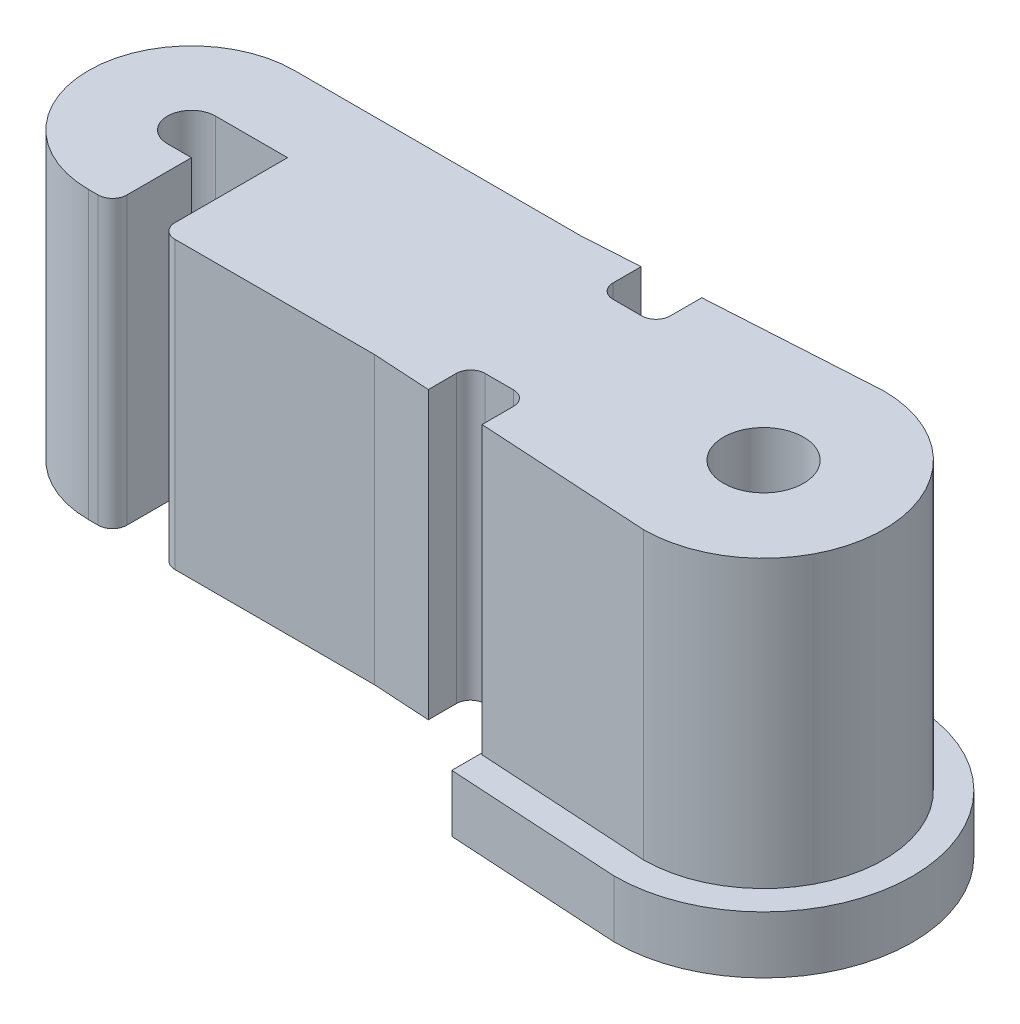
ISO-10303-21;
HEADER;
FILE_DESCRIPTION(('STEP AP214'),'2;1');
FILE_NAME('part.step','',(''),(''),'','','');
FILE_SCHEMA(('AUTOMOTIVE_DESIGN { 1 0 10303 214 1 1 1 1 }'));
ENDSEC;
DATA;
#1=APPLICATION_CONTEXT('core data for automotive mechanical design processes');
#2=APPLICATION_PROTOCOL_DEFINITION('international standard','automotive_design',2000,#1);
#3=PRODUCT_CONTEXT('',#1,'mechanical');
#4=PRODUCT('Part','Part','',(#3));
#5=PRODUCT_RELATED_PRODUCT_CATEGORY('part','',(#4));
#6=PRODUCT_DEFINITION_FORMATION('','',#4);
#7=PRODUCT_DEFINITION_CONTEXT('part definition',#1,'design');
#8=PRODUCT_DEFINITION('design','',#6,#7);
#9=PRODUCT_DEFINITION_SHAPE('','',#8);
#10=(LENGTH_UNIT() NAMED_UNIT(*) SI_UNIT(.MILLI.,.METRE.));
#11=(NAMED_UNIT(*) PLANE_ANGLE_UNIT() SI_UNIT($,.RADIAN.));
#12=(NAMED_UNIT(*) SI_UNIT($,.STERADIAN.) SOLID_ANGLE_UNIT());
#13=UNCERTAINTY_MEASURE_WITH_UNIT(LENGTH_MEASURE(1.E-05),#10,'distance_accuracy_value','');
#14=(GEOMETRIC_REPRESENTATION_CONTEXT(3) GLOBAL_UNCERTAINTY_ASSIGNED_CONTEXT((#13)) GLOBAL_UNIT_ASSIGNED_CONTEXT((#10,
#11,#12)) REPRESENTATION_CONTEXT('',''));
#15=CARTESIAN_POINT('',(0.,0.,0.));
#16=DIRECTION('',(0.,0.,1.));
#17=DIRECTION('',(1.,0.,0.));
#18=AXIS2_PLACEMENT_3D('',#15,#16,#17);
#19=CARTESIAN_POINT('',(0.,0.,0.));
#20=DIRECTION('',(0.,-1.,0.));
#21=DIRECTION('',(0.,0.,-1.));
#22=AXIS2_PLACEMENT_3D('',#19,#20,#21);
#23=PLANE('',#22);
#24=CARTESIAN_POINT('',(-1.625,0.,-0.685));
#25=DIRECTION('',(0.,-1.,0.));
#26=DIRECTION('',(0.,0.,-1.));
#27=AXIS2_PLACEMENT_3D('',#24,#25,#26);
#28=CIRCLE('',#27,0.125);
#29=CARTESIAN_POINT('',(-1.625,0.,-0.56));
#30=VERTEX_POINT('',#29);
#31=CARTESIAN_POINT('',(-1.51497307268199,0.,-0.625678205818127));
#32=VERTEX_POINT('',#31);
#33=EDGE_CURVE('E477',#30,#32,#28,.F.);
#34=ORIENTED_EDGE('',*,*,#33,.T.);
#35=DIRECTION('',(0.,0.,1.));
#36=VECTOR('',#35,1.);
#37=CARTESIAN_POINT('',(-1.51497307268199,0.,1.20955121136645));
#38=LINE('',#37,#36);
#39=CARTESIAN_POINT('',(-1.51497307268199,0.,0.625678205818127));
#40=VERTEX_POINT('',#39);
#41=EDGE_CURVE('E11',#32,#40,#38,.T.);
#42=ORIENTED_EDGE('',*,*,#41,.T.);
#43=CARTESIAN_POINT('',(-1.625,0.,0.685));
#44=DIRECTION('',(0.,-1.,0.));
#45=DIRECTION('',(0.,0.,-1.));
#46=AXIS2_PLACEMENT_3D('',#43,#44,#45);
#47=CIRCLE('',#46,0.125);
#48=CARTESIAN_POINT('',(-1.625,0.,0.56));
#49=VERTEX_POINT('',#48);
#50=EDGE_CURVE('E471',#40,#49,#47,.F.);
#51=ORIENTED_EDGE('',*,*,#50,.T.);
#52=DIRECTION('',(-1.,0.,0.));
#53=VECTOR('',#52,1.);
#54=CARTESIAN_POINT('',(-1.5,0.,0.56));
#55=LINE('',#54,#53);
#56=CARTESIAN_POINT('',(-1.875,0.,0.56));
#57=VERTEX_POINT('',#56);
#58=EDGE_CURVE('E390',#49,#57,#55,.T.);
#59=ORIENTED_EDGE('',*,*,#58,.T.);
#60=CARTESIAN_POINT('',(-1.875,0.,0.685));
#61=DIRECTION('',(0.,-1.,0.));
#62=DIRECTION('',(0.,0.,-1.));
#63=AXIS2_PLACEMENT_3D('',#60,#61,#62);
#64=CIRCLE('',#63,0.125);
#65=CARTESIAN_POINT('',(-2.,0.,0.685));
#66=VERTEX_POINT('',#65);
#67=EDGE_CURVE('E60',#57,#66,#64,.F.);
#68=ORIENTED_EDGE('',*,*,#67,.T.);
#69=DIRECTION('',(0.,0.,-1.));
#70=VECTOR('',#69,1.);
#71=CARTESIAN_POINT('',(-2.,0.,0.93));
#72=LINE('',#71,#70);
#73=CARTESIAN_POINT('',(-2.,0.,0.93));
#74=VERTEX_POINT('',#73);
#75=EDGE_CURVE('E392',#74,#66,#72,.T.);
#76=ORIENTED_EDGE('',*,*,#75,.F.);
#77=DIRECTION('',(0.998204845465779,0.,0.0598922907279451));
#78=VECTOR('',#77,1.);
#79=CARTESIAN_POINT('',(-2.50000000000002,0.,0.9));
#80=LINE('',#79,#78);
#81=CARTESIAN_POINT('',(-2.50000000000002,0.,0.9));
#82=VERTEX_POINT('',#81);
#83=EDGE_CURVE('E394',#82,#74,#80,.T.);
#84=ORIENTED_EDGE('',*,*,#83,.F.);
#85=DIRECTION('',(-1.,0.,0.));
#86=VECTOR('',#85,1.);
#87=CARTESIAN_POINT('',(-2.50000000000002,0.,0.9));
#88=LINE('',#87,#86);
#89=CARTESIAN_POINT('',(-4.245,0.,0.9));
#90=VERTEX_POINT('',#89);
#91=EDGE_CURVE('E397',#82,#90,#88,.T.);
#92=ORIENTED_EDGE('',*,*,#91,.T.);
#93=CARTESIAN_POINT('',(-4.245,0.,0.775));
#94=DIRECTION('',(0.,-1.,0.));
#95=DIRECTION('',(0.,0.,-1.));
#96=AXIS2_PLACEMENT_3D('',#93,#94,#95);
#97=CIRCLE('',#96,0.125);
#98=CARTESIAN_POINT('',(-4.37,0.,0.775));
#99=VERTEX_POINT('',#98);
#100=EDGE_CURVE('E441',#90,#99,#97,.T.);
#101=ORIENTED_EDGE('',*,*,#100,.T.);
#102=DIRECTION('',(0.,0.,-1.));
#103=VECTOR('',#102,1.);
#104=CARTESIAN_POINT('',(-4.37,0.,0.9));
#105=LINE('',#104,#103);
#106=CARTESIAN_POINT('',(-4.37,0.,-0.21));
#107=VERTEX_POINT('',#106);
#108=EDGE_CURVE('E300',#99,#107,#105,.T.);
#109=ORIENTED_EDGE('',*,*,#108,.T.);
#110=DIRECTION('',(-1.,0.,0.));
#111=VECTOR('',#110,1.);
#112=CARTESIAN_POINT('',(-4.37,0.,-0.21));
#113=LINE('',#112,#111);
#114=CARTESIAN_POINT('',(-5.,0.,-0.21));
#115=VERTEX_POINT('',#114);
#116=EDGE_CURVE('E302',#107,#115,#113,.T.);
#117=ORIENTED_EDGE('',*,*,#116,.T.);
#118=CARTESIAN_POINT('',(-5.,0.,0.));
#119=DIRECTION('',(0.,1.,0.));
#120=DIRECTION('',(0.,0.,1.));
#121=AXIS2_PLACEMENT_3D('',#118,#119,#120);
#122=CIRCLE('',#121,0.21);
#123=CARTESIAN_POINT('',(-5.,0.,0.21));
#124=VERTEX_POINT('',#123);
#125=EDGE_CURVE('E305',#115,#124,#122,.T.);
#126=ORIENTED_EDGE('',*,*,#125,.T.);
#127=DIRECTION('',(1.,0.,0.));
#128=VECTOR('',#127,1.);
#129=CARTESIAN_POINT('',(-4.79,0.,0.21));
#130=LINE('',#129,#128);
#131=CARTESIAN_POINT('',(-4.79,0.,0.21));
#132=VERTEX_POINT('',#131);
#133=EDGE_CURVE('E293',#124,#132,#130,.T.);
#134=ORIENTED_EDGE('',*,*,#133,.T.);
#135=DIRECTION('',(0.,0.,1.));
#136=VECTOR('',#135,1.);
#137=CARTESIAN_POINT('',(-4.79,0.,0.9));
#138=LINE('',#137,#136);
#139=CARTESIAN_POINT('',(-4.79,0.,0.775));
#140=VERTEX_POINT('',#139);
#141=EDGE_CURVE('E296',#132,#140,#138,.T.);
#142=ORIENTED_EDGE('',*,*,#141,.T.);
#143=CARTESIAN_POINT('',(-4.915,0.,0.775));
#144=DIRECTION('',(0.,-1.,0.));
#145=DIRECTION('',(0.,0.,-1.));
#146=AXIS2_PLACEMENT_3D('',#143,#144,#145);
#147=CIRCLE('',#146,0.125);
#148=CARTESIAN_POINT('',(-4.915,0.,0.9));
#149=VERTEX_POINT('',#148);
#150=EDGE_CURVE('E439',#140,#149,#147,.T.);
#151=ORIENTED_EDGE('',*,*,#150,.T.);
#152=CARTESIAN_POINT('',(-5.,0.,0.9));
#153=VERTEX_POINT('',#152);
#154=EDGE_CURVE('E396',#149,#153,#88,.T.);
#155=ORIENTED_EDGE('',*,*,#154,.T.);
#156=CARTESIAN_POINT('',(-5.,0.,0.));
#157=DIRECTION('',(0.,1.,0.));
#158=DIRECTION('',(0.,0.,1.));
#159=AXIS2_PLACEMENT_3D('',#156,#157,#158);
#160=CIRCLE('',#159,0.9);
#161=CARTESIAN_POINT('',(-5.,0.,-0.9));
#162=VERTEX_POINT('',#161);
#163=EDGE_CURVE('E400',#162,#153,#160,.T.);
#164=ORIENTED_EDGE('',*,*,#163,.F.);
#165=DIRECTION('',(-1.,0.,0.));
#166=VECTOR('',#165,1.);
#167=CARTESIAN_POINT('',(-2.50000000000002,0.,-0.9));
#168=LINE('',#167,#166);
#169=CARTESIAN_POINT('',(-2.50000000000002,0.,-0.9));
#170=VERTEX_POINT('',#169);
#171=EDGE_CURVE('E332',#170,#162,#168,.T.);
#172=ORIENTED_EDGE('',*,*,#171,.F.);
#173=DIRECTION('',(0.998204845465779,0.,-0.0598922907279451));
#174=VECTOR('',#173,1.);
#175=CARTESIAN_POINT('',(-2.50000000000002,0.,-0.9));
#176=LINE('',#175,#174);
#177=CARTESIAN_POINT('',(-2.,0.,-0.93));
#178=VERTEX_POINT('',#177);
#179=EDGE_CURVE('E288',#170,#178,#176,.T.);
#180=ORIENTED_EDGE('',*,*,#179,.T.);
#181=DIRECTION('',(0.,0.,1.));
#182=VECTOR('',#181,1.);
#183=CARTESIAN_POINT('',(-2.,0.,-0.93));
#184=LINE('',#183,#182);
#185=CARTESIAN_POINT('',(-2.,0.,-0.685));
#186=VERTEX_POINT('',#185);
#187=EDGE_CURVE('E372',#178,#186,#184,.T.);
#188=ORIENTED_EDGE('',*,*,#187,.T.);
#189=CARTESIAN_POINT('',(-1.875,0.,-0.685));
#190=DIRECTION('',(0.,-1.,0.));
#191=DIRECTION('',(0.,0.,-1.));
#192=AXIS2_PLACEMENT_3D('',#189,#190,#191);
#193=CIRCLE('',#192,0.125);
#194=CARTESIAN_POINT('',(-1.875,0.,-0.56));
#195=VERTEX_POINT('',#194);
#196=EDGE_CURVE('E481',#186,#195,#193,.F.);
#197=ORIENTED_EDGE('',*,*,#196,.T.);
#198=DIRECTION('',(1.,0.,0.));
#199=VECTOR('',#198,1.);
#200=CARTESIAN_POINT('',(-2.,0.,-0.56));
#201=LINE('',#200,#199);
#202=EDGE_CURVE('E375',#195,#30,#201,.T.);
#203=ORIENTED_EDGE('',*,*,#202,.T.);
#204=EDGE_LOOP('',(#34,#42,#51,#59,#68,#76,#84,#92,#101,#109,#117,#126,#134,#142,#151,#155,#164,
#172,#180,#188,#197,#203));
#205=FACE_BOUND('',#204,.T.);
#206=ADVANCED_FACE('F35',(#205),#23,.T.);
#207=CARTESIAN_POINT('',(-2.50000000000002,2.5,0.9));
#208=DIRECTION('',(0.,0.,1.));
#209=DIRECTION('',(1.,0.,0.));
#210=AXIS2_PLACEMENT_3D('',#207,#208,#209);
#211=PLANE('',#210);
#212=DIRECTION('',(-1.,0.,0.));
#213=VECTOR('',#212,1.);
#214=CARTESIAN_POINT('',(-2.50000000000002,2.5,0.9));
#215=LINE('',#214,#213);
#216=CARTESIAN_POINT('',(-2.50000000000002,2.5,0.9));
#217=VERTEX_POINT('',#216);
#218=CARTESIAN_POINT('',(-4.245,2.5,0.9));
#219=VERTEX_POINT('',#218);
#220=EDGE_CURVE('E361',#217,#219,#215,.T.);
#221=ORIENTED_EDGE('',*,*,#220,.T.);
#222=DIRECTION('',(0.,1.,0.));
#223=VECTOR('',#222,1.);
#224=CARTESIAN_POINT('',(-4.245,0.,0.9));
#225=LINE('',#224,#223);
#226=EDGE_CURVE('E437',#219,#90,#225,.F.);
#227=ORIENTED_EDGE('',*,*,#226,.T.);
#228=ORIENTED_EDGE('',*,*,#91,.F.);
#229=DIRECTION('',(0.,-1.,0.));
#230=VECTOR('',#229,1.);
#231=CARTESIAN_POINT('',(-2.50000000000002,2.5,0.9));
#232=LINE('',#231,#230);
#233=EDGE_CURVE('E413',#217,#82,#232,.T.);
#234=ORIENTED_EDGE('',*,*,#233,.F.);
#235=EDGE_LOOP('',(#221,#227,#228,#234));
#236=FACE_BOUND('',#235,.T.);
#237=ADVANCED_FACE('F553',(#236),#211,.T.);
#238=CARTESIAN_POINT('',(-2.50000000000002,2.5,-0.9));
#239=DIRECTION('',(-0.0598922907279451,0.,-0.998204845465779));
#240=DIRECTION('',(-0.998204845465779,0.,0.0598922907279451));
#241=AXIS2_PLACEMENT_3D('',#238,#239,#240);
#242=PLANE('',#241);
#243=ORIENTED_EDGE('',*,*,#179,.F.);
#244=DIRECTION('',(0.,-1.,0.));
#245=VECTOR('',#244,1.);
#246=CARTESIAN_POINT('',(-2.50000000000002,2.5,-0.9));
#247=LINE('',#246,#245);
#248=CARTESIAN_POINT('',(-2.50000000000002,2.5,-0.9));
#249=VERTEX_POINT('',#248);
#250=EDGE_CURVE('E404',#249,#170,#247,.T.);
#251=ORIENTED_EDGE('',*,*,#250,.F.);
#252=DIRECTION('',(0.998204845465779,0.,-0.0598922907279451));
#253=VECTOR('',#252,1.);
#254=CARTESIAN_POINT('',(-2.50000000000002,2.5,-0.9));
#255=LINE('',#254,#253);
#256=CARTESIAN_POINT('',(-2.,2.5,-0.93));
#257=VERTEX_POINT('',#256);
#258=EDGE_CURVE('E328',#249,#257,#255,.T.);
#259=ORIENTED_EDGE('',*,*,#258,.T.);
#260=DIRECTION('',(0.,-1.,0.));
#261=VECTOR('',#260,1.);
#262=CARTESIAN_POINT('',(-2.,2.5,-0.93));
#263=LINE('',#262,#261);
#264=EDGE_CURVE('E369',#257,#178,#263,.T.);
#265=ORIENTED_EDGE('',*,*,#264,.T.);
#266=EDGE_LOOP('',(#243,#251,#259,#265));
#267=FACE_BOUND('',#266,.T.);
#268=ADVANCED_FACE('F598',(#267),#242,.T.);
#269=CARTESIAN_POINT('',(-2.50000000000002,2.5,-0.9));
#270=DIRECTION('',(0.,0.,1.));
#271=DIRECTION('',(1.,0.,0.));
#272=AXIS2_PLACEMENT_3D('',#269,#270,#271);
#273=PLANE('',#272);
#274=ORIENTED_EDGE('',*,*,#171,.T.);
#275=DIRECTION('',(0.,-1.,0.));
#276=VECTOR('',#275,1.);
#277=CARTESIAN_POINT('',(-5.,2.5,-0.9));
#278=LINE('',#277,#276);
#279=CARTESIAN_POINT('',(-5.,2.5,-0.9));
#280=VERTEX_POINT('',#279);
#281=EDGE_CURVE('E407',#280,#162,#278,.T.);
#282=ORIENTED_EDGE('',*,*,#281,.F.);
#283=DIRECTION('',(-1.,0.,0.));
#284=VECTOR('',#283,1.);
#285=CARTESIAN_POINT('',(-2.50000000000002,2.5,-0.9));
#286=LINE('',#285,#284);
#287=EDGE_CURVE('E367',#249,#280,#286,.T.);
#288=ORIENTED_EDGE('',*,*,#287,.F.);
#289=ORIENTED_EDGE('',*,*,#250,.T.);
#290=EDGE_LOOP('',(#274,#282,#288,#289));
#291=FACE_BOUND('',#290,.T.);
#292=ADVANCED_FACE('F599',(#291),#273,.F.);
#293=CARTESIAN_POINT('',(-5.,2.5,0.));
#294=DIRECTION('',(0.,-1.,0.));
#295=DIRECTION('',(0.,0.,-1.));
#296=AXIS2_PLACEMENT_3D('',#293,#294,#295);
#297=CYLINDRICAL_SURFACE('',#296,0.9);
#298=ORIENTED_EDGE('',*,*,#163,.T.);
#299=DIRECTION('',(0.,-1.,0.));
#300=VECTOR('',#299,1.);
#301=CARTESIAN_POINT('',(-5.,2.5,0.9));
#302=LINE('',#301,#300);
#303=CARTESIAN_POINT('',(-5.,2.5,0.9));
#304=VERTEX_POINT('',#303);
#305=EDGE_CURVE('E410',#304,#153,#302,.T.);
#306=ORIENTED_EDGE('',*,*,#305,.F.);
#307=CARTESIAN_POINT('',(-5.,2.5,0.));
#308=DIRECTION('',(0.,1.,0.));
#309=DIRECTION('',(0.,0.,1.));
#310=AXIS2_PLACEMENT_3D('',#307,#308,#309);
#311=CIRCLE('',#310,0.9);
#312=EDGE_CURVE('E364',#280,#304,#311,.T.);
#313=ORIENTED_EDGE('',*,*,#312,.F.);
#314=ORIENTED_EDGE('',*,*,#281,.T.);
#315=EDGE_LOOP('',(#298,#306,#313,#314));
#316=FACE_BOUND('',#315,.T.);
#317=ADVANCED_FACE('F592',(#316),#297,.T.);
#318=ORIENTED_EDGE('',*,*,#154,.F.);
#319=DIRECTION('',(0.,1.,0.));
#320=VECTOR('',#319,1.);
#321=CARTESIAN_POINT('',(-4.915,2.5,0.9));
#322=LINE('',#321,#320);
#323=CARTESIAN_POINT('',(-4.915,2.5,0.9));
#324=VERTEX_POINT('',#323);
#325=EDGE_CURVE('E443',#149,#324,#322,.T.);
#326=ORIENTED_EDGE('',*,*,#325,.T.);
#327=EDGE_CURVE('E360',#324,#304,#215,.T.);
#328=ORIENTED_EDGE('',*,*,#327,.T.);
#329=ORIENTED_EDGE('',*,*,#305,.T.);
#330=EDGE_LOOP('',(#318,#326,#328,#329));
#331=FACE_BOUND('',#330,.T.);
#332=ADVANCED_FACE('F586',(#331),#211,.T.);
#333=CARTESIAN_POINT('',(-2.50000000000002,2.5,0.9));
#334=DIRECTION('',(0.0598922907279451,0.,-0.998204845465779));
#335=DIRECTION('',(-0.998204845465779,0.,-0.0598922907279451));
#336=AXIS2_PLACEMENT_3D('',#333,#334,#335);
#337=PLANE('',#336);
#338=ORIENTED_EDGE('',*,*,#83,.T.);
#339=DIRECTION('',(0.,-1.,0.));
#340=VECTOR('',#339,1.);
#341=CARTESIAN_POINT('',(-2.,2.5,0.93));
#342=LINE('',#341,#340);
#343=CARTESIAN_POINT('',(-2.,2.5,0.93));
#344=VERTEX_POINT('',#343);
#345=EDGE_CURVE('E415',#344,#74,#342,.T.);
#346=ORIENTED_EDGE('',*,*,#345,.F.);
#347=DIRECTION('',(0.998204845465779,0.,0.0598922907279451));
#348=VECTOR('',#347,1.);
#349=CARTESIAN_POINT('',(-2.50000000000002,2.5,0.9));
#350=LINE('',#349,#348);
#351=EDGE_CURVE('E358',#217,#344,#350,.T.);
#352=ORIENTED_EDGE('',*,*,#351,.F.);
#353=ORIENTED_EDGE('',*,*,#233,.T.);
#354=EDGE_LOOP('',(#338,#346,#352,#353));
#355=FACE_BOUND('',#354,.T.);
#356=ADVANCED_FACE('F548',(#355),#337,.F.);
#357=CARTESIAN_POINT('',(-2.,2.5,0.93));
#358=DIRECTION('',(-1.,0.,0.));
#359=DIRECTION('',(0.,0.,1.));
#360=AXIS2_PLACEMENT_3D('',#357,#358,#359);
#361=PLANE('',#360);
#362=ORIENTED_EDGE('',*,*,#75,.T.);
#363=DIRECTION('',(0.,-1.,0.));
#364=VECTOR('',#363,1.);
#365=CARTESIAN_POINT('',(-2.,2.5,0.685));
#366=LINE('',#365,#364);
#367=CARTESIAN_POINT('',(-2.,2.5,0.685));
#368=VERTEX_POINT('',#367);
#369=EDGE_CURVE('E453',#66,#368,#366,.F.);
#370=ORIENTED_EDGE('',*,*,#369,.T.);
#371=DIRECTION('',(0.,0.,-1.));
#372=VECTOR('',#371,1.);
#373=CARTESIAN_POINT('',(-2.,2.5,0.93));
#374=LINE('',#373,#372);
#375=EDGE_CURVE('E355',#344,#368,#374,.T.);
#376=ORIENTED_EDGE('',*,*,#375,.F.);
#377=ORIENTED_EDGE('',*,*,#345,.T.);
#378=EDGE_LOOP('',(#362,#370,#376,#377));
#379=FACE_BOUND('',#378,.T.);
#380=ADVANCED_FACE('F543',(#379),#361,.F.);
#381=CARTESIAN_POINT('',(-1.5,2.5,0.56));
#382=DIRECTION('',(0.,0.,1.));
#383=DIRECTION('',(1.,0.,0.));
#384=AXIS2_PLACEMENT_3D('',#381,#382,#383);
#385=PLANE('',#384);
#386=DIRECTION('',(-1.,0.,0.));
#387=VECTOR('',#386,1.);
#388=CARTESIAN_POINT('',(-1.5,2.5,0.56));
#389=LINE('',#388,#387);
#390=CARTESIAN_POINT('',(-1.625,2.5,0.56));
#391=VERTEX_POINT('',#390);
#392=CARTESIAN_POINT('',(-1.875,2.5,0.56));
#393=VERTEX_POINT('',#392);
#394=EDGE_CURVE('E352',#391,#393,#389,.T.);
#395=ORIENTED_EDGE('',*,*,#394,.T.);
#396=DIRECTION('',(0.,-1.,0.));
#397=VECTOR('',#396,1.);
#398=CARTESIAN_POINT('',(-1.875,2.5,0.56));
#399=LINE('',#398,#397);
#400=EDGE_CURVE('E450',#393,#57,#399,.T.);
#401=ORIENTED_EDGE('',*,*,#400,.T.);
#402=ORIENTED_EDGE('',*,*,#58,.F.);
#403=DIRECTION('',(0.,-1.,0.));
#404=VECTOR('',#403,1.);
#405=CARTESIAN_POINT('',(-1.625,2.5,0.56));
#406=LINE('',#405,#404);
#407=EDGE_CURVE('E448',#49,#391,#406,.F.);
#408=ORIENTED_EDGE('',*,*,#407,.T.);
#409=EDGE_LOOP('',(#395,#401,#402,#408));
#410=FACE_BOUND('',#409,.T.);
#411=ADVANCED_FACE('F534',(#410),#385,.T.);
#412=CARTESIAN_POINT('',(-1.5,2.5,0.56));
#413=DIRECTION('',(1.,0.,0.));
#414=DIRECTION('',(0.,0.,-1.));
#415=AXIS2_PLACEMENT_3D('',#412,#413,#414);
#416=PLANE('',#415);
#417=DIRECTION('',(0.,0.,1.));
#418=VECTOR('',#417,1.);
#419=CARTESIAN_POINT('',(-1.5,2.5,0.56));
#420=LINE('',#419,#418);
#421=CARTESIAN_POINT('',(-1.5,2.5,0.685));
#422=VERTEX_POINT('',#421);
#423=CARTESIAN_POINT('',(-1.5,2.5,0.96));
#424=VERTEX_POINT('',#423);
#425=EDGE_CURVE('E350',#422,#424,#420,.T.);
#426=ORIENTED_EDGE('',*,*,#425,.F.);
#427=DIRECTION('',(0.,-1.,0.));
#428=VECTOR('',#427,1.);
#429=CARTESIAN_POINT('',(-1.5,2.5,0.685));
#430=LINE('',#429,#428);
#431=CARTESIAN_POINT('',(-1.5,0.,0.685));
#432=VERTEX_POINT('',#431);
#433=EDGE_CURVE('E455',#422,#432,#430,.T.);
#434=ORIENTED_EDGE('',*,*,#433,.T.);
#435=DIRECTION('',(0.,0.,1.));
#436=VECTOR('',#435,1.);
#437=CARTESIAN_POINT('',(-1.5,0.,0.56));
#438=LINE('',#437,#436);
#439=CARTESIAN_POINT('',(-1.5,0.,0.96));
#440=VERTEX_POINT('',#439);
#441=EDGE_CURVE('E387',#432,#440,#438,.T.);
#442=ORIENTED_EDGE('',*,*,#441,.T.);
#443=DIRECTION('',(0.,-1.,0.));
#444=VECTOR('',#443,1.);
#445=CARTESIAN_POINT('',(-1.5,2.5,0.96));
#446=LINE('',#445,#444);
#447=EDGE_CURVE('E418',#424,#440,#446,.T.);
#448=ORIENTED_EDGE('',*,*,#447,.F.);
#449=EDGE_LOOP('',(#426,#434,#442,#448));
#450=FACE_BOUND('',#449,.T.);
#451=ADVANCED_FACE('F525',(#450),#416,.F.);
#452=CARTESIAN_POINT('',(0.,2.5,1.05));
#453=DIRECTION('',(-0.0598922907279466,0.,0.998204845465779));
#454=DIRECTION('',(0.998204845465779,0.,0.0598922907279466));
#455=AXIS2_PLACEMENT_3D('',#452,#453,#454);
#456=PLANE('',#455);
#457=DIRECTION('',(-0.998204845465779,0.,-0.0598922907279466));
#458=VECTOR('',#457,1.);
#459=CARTESIAN_POINT('',(0.,0.,1.05));
#460=LINE('',#459,#458);
#461=CARTESIAN_POINT('',(0.,0.,1.05));
#462=VERTEX_POINT('',#461);
#463=EDGE_CURVE('E385',#462,#440,#460,.T.);
#464=ORIENTED_EDGE('',*,*,#463,.F.);
#465=DIRECTION('',(0.,-1.,0.));
#466=VECTOR('',#465,1.);
#467=CARTESIAN_POINT('',(0.,2.5,1.05));
#468=LINE('',#467,#466);
#469=CARTESIAN_POINT('',(0.,2.5,1.05));
#470=VERTEX_POINT('',#469);
#471=EDGE_CURVE('E421',#470,#462,#468,.T.);
#472=ORIENTED_EDGE('',*,*,#471,.F.);
#473=DIRECTION('',(-0.998204845465779,0.,-0.0598922907279466));
#474=VECTOR('',#473,1.);
#475=CARTESIAN_POINT('',(0.,2.5,1.05));
#476=LINE('',#475,#474);
#477=EDGE_CURVE('E347',#470,#424,#476,.T.);
#478=ORIENTED_EDGE('',*,*,#477,.T.);
#479=ORIENTED_EDGE('',*,*,#447,.T.);
#480=EDGE_LOOP('',(#464,#472,#478,#479));
#481=FACE_BOUND('',#480,.T.);
#482=ADVANCED_FACE('F521',(#481),#456,.T.);
#483=CARTESIAN_POINT('',(0.,2.5,0.));
#484=DIRECTION('',(0.,-1.,0.));
#485=DIRECTION('',(0.,0.,-1.));
#486=AXIS2_PLACEMENT_3D('',#483,#484,#485);
#487=CYLINDRICAL_SURFACE('',#486,1.05);
#488=CARTESIAN_POINT('',(0.,0.,0.));
#489=DIRECTION('',(0.,-1.,0.));
#490=DIRECTION('',(0.,0.,-1.));
#491=AXIS2_PLACEMENT_3D('',#488,#489,#490);
#492=CIRCLE('',#491,1.05);
#493=CARTESIAN_POINT('',(0.,0.,-1.05));
#494=VERTEX_POINT('',#493);
#495=EDGE_CURVE('E383',#494,#462,#492,.T.);
#496=ORIENTED_EDGE('',*,*,#495,.F.);
#497=DIRECTION('',(0.,-1.,0.));
#498=VECTOR('',#497,1.);
#499=CARTESIAN_POINT('',(0.,2.5,-1.05));
#500=LINE('',#499,#498);
#501=CARTESIAN_POINT('',(0.,2.5,-1.05));
#502=VERTEX_POINT('',#501);
#503=EDGE_CURVE('E424',#502,#494,#500,.T.);
#504=ORIENTED_EDGE('',*,*,#503,.F.);
#505=CARTESIAN_POINT('',(0.,2.5,0.));
#506=DIRECTION('',(0.,-1.,0.));
#507=DIRECTION('',(0.,0.,-1.));
#508=AXIS2_PLACEMENT_3D('',#505,#506,#507);
#509=CIRCLE('',#508,1.05);
#510=EDGE_CURVE('E344',#502,#470,#509,.T.);
#511=ORIENTED_EDGE('',*,*,#510,.T.);
#512=ORIENTED_EDGE('',*,*,#471,.T.);
#513=EDGE_LOOP('',(#496,#504,#511,#512));
#514=FACE_BOUND('',#513,.T.);
#515=ADVANCED_FACE('F517',(#514),#487,.T.);
#516=CARTESIAN_POINT('',(-1.5,2.5,-0.96));
#517=DIRECTION('',(-0.0598922907279466,0.,-0.998204845465779));
#518=DIRECTION('',(-0.998204845465779,0.,0.0598922907279466));
#519=AXIS2_PLACEMENT_3D('',#516,#517,#518);
#520=PLANE('',#519);
#521=DIRECTION('',(0.998204845465779,0.,-0.0598922907279466));
#522=VECTOR('',#521,1.);
#523=CARTESIAN_POINT('',(-1.5,0.,-0.96));
#524=LINE('',#523,#522);
#525=CARTESIAN_POINT('',(-1.5,0.,-0.96));
#526=VERTEX_POINT('',#525);
#527=EDGE_CURVE('E381',#526,#494,#524,.T.);
#528=ORIENTED_EDGE('',*,*,#527,.F.);
#529=DIRECTION('',(0.,-1.,0.));
#530=VECTOR('',#529,1.);
#531=CARTESIAN_POINT('',(-1.5,2.5,-0.96));
#532=LINE('',#531,#530);
#533=CARTESIAN_POINT('',(-1.5,2.5,-0.96));
#534=VERTEX_POINT('',#533);
#535=EDGE_CURVE('E427',#534,#526,#532,.T.);
#536=ORIENTED_EDGE('',*,*,#535,.F.);
#537=DIRECTION('',(0.998204845465779,0.,-0.0598922907279466));
#538=VECTOR('',#537,1.);
#539=CARTESIAN_POINT('',(-1.5,2.5,-0.96));
#540=LINE('',#539,#538);
#541=EDGE_CURVE('E341',#534,#502,#540,.T.);
#542=ORIENTED_EDGE('',*,*,#541,.T.);
#543=ORIENTED_EDGE('',*,*,#503,.T.);
#544=EDGE_LOOP('',(#528,#536,#542,#543));
#545=FACE_BOUND('',#544,.T.);
#546=ADVANCED_FACE('F513',(#545),#520,.T.);
#547=CARTESIAN_POINT('',(-1.5,2.5,-0.96));
#548=DIRECTION('',(1.,0.,0.));
#549=DIRECTION('',(0.,0.,-1.));
#550=AXIS2_PLACEMENT_3D('',#547,#548,#549);
#551=PLANE('',#550);
#552=DIRECTION('',(0.,0.,1.));
#553=VECTOR('',#552,1.);
#554=CARTESIAN_POINT('',(-1.5,0.,-0.96));
#555=LINE('',#554,#553);
#556=CARTESIAN_POINT('',(-1.5,0.,-0.685));
#557=VERTEX_POINT('',#556);
#558=EDGE_CURVE('E378',#526,#557,#555,.T.);
#559=ORIENTED_EDGE('',*,*,#558,.T.);
#560=DIRECTION('',(0.,-1.,0.));
#561=VECTOR('',#560,1.);
#562=CARTESIAN_POINT('',(-1.5,2.5,-0.685));
#563=LINE('',#562,#561);
#564=CARTESIAN_POINT('',(-1.5,2.5,-0.685));
#565=VERTEX_POINT('',#564);
#566=EDGE_CURVE('E463',#557,#565,#563,.F.);
#567=ORIENTED_EDGE('',*,*,#566,.T.);
#568=DIRECTION('',(0.,0.,1.));
#569=VECTOR('',#568,1.);
#570=CARTESIAN_POINT('',(-1.5,2.5,-0.96));
#571=LINE('',#570,#569);
#572=EDGE_CURVE('E338',#534,#565,#571,.T.);
#573=ORIENTED_EDGE('',*,*,#572,.F.);
#574=ORIENTED_EDGE('',*,*,#535,.T.);
#575=EDGE_LOOP('',(#559,#567,#573,#574));
#576=FACE_BOUND('',#575,.T.);
#577=ADVANCED_FACE('F508',(#576),#551,.F.);
#578=CARTESIAN_POINT('',(-2.,2.5,-0.56));
#579=DIRECTION('',(0.,0.,-1.));
#580=DIRECTION('',(-1.,0.,0.));
#581=AXIS2_PLACEMENT_3D('',#578,#579,#580);
#582=PLANE('',#581);
#583=DIRECTION('',(1.,0.,0.));
#584=VECTOR('',#583,1.);
#585=CARTESIAN_POINT('',(-2.,2.5,-0.56));
#586=LINE('',#585,#584);
#587=CARTESIAN_POINT('',(-1.875,2.5,-0.56));
#588=VERTEX_POINT('',#587);
#589=CARTESIAN_POINT('',(-1.625,2.5,-0.56));
#590=VERTEX_POINT('',#589);
#591=EDGE_CURVE('E335',#588,#590,#586,.T.);
#592=ORIENTED_EDGE('',*,*,#591,.T.);
#593=DIRECTION('',(0.,-1.,0.));
#594=VECTOR('',#593,1.);
#595=CARTESIAN_POINT('',(-1.625,2.5,-0.56));
#596=LINE('',#595,#594);
#597=EDGE_CURVE('E460',#590,#30,#596,.T.);
#598=ORIENTED_EDGE('',*,*,#597,.T.);
#599=ORIENTED_EDGE('',*,*,#202,.F.);
#600=DIRECTION('',(0.,-1.,0.));
#601=VECTOR('',#600,1.);
#602=CARTESIAN_POINT('',(-1.875,2.5,-0.56));
#603=LINE('',#602,#601);
#604=EDGE_CURVE('E458',#195,#588,#603,.F.);
#605=ORIENTED_EDGE('',*,*,#604,.T.);
#606=EDGE_LOOP('',(#592,#598,#599,#605));
#607=FACE_BOUND('',#606,.T.);
#608=ADVANCED_FACE('F497',(#607),#582,.T.);
#609=CARTESIAN_POINT('',(-2.,2.5,-0.93));
#610=DIRECTION('',(1.,0.,0.));
#611=DIRECTION('',(0.,0.,-1.));
#612=AXIS2_PLACEMENT_3D('',#609,#610,#611);
#613=PLANE('',#612);
#614=DIRECTION('',(0.,0.,1.));
#615=VECTOR('',#614,1.);
#616=CARTESIAN_POINT('',(-2.,2.5,-0.93));
#617=LINE('',#616,#615);
#618=CARTESIAN_POINT('',(-2.,2.5,-0.685));
#619=VERTEX_POINT('',#618);
#620=EDGE_CURVE('E331',#257,#619,#617,.T.);
#621=ORIENTED_EDGE('',*,*,#620,.T.);
#622=DIRECTION('',(0.,-1.,0.));
#623=VECTOR('',#622,1.);
#624=CARTESIAN_POINT('',(-2.,0.,-0.685));
#625=LINE('',#624,#623);
#626=EDGE_CURVE('E465',#619,#186,#625,.T.);
#627=ORIENTED_EDGE('',*,*,#626,.T.);
#628=ORIENTED_EDGE('',*,*,#187,.F.);
#629=ORIENTED_EDGE('',*,*,#264,.F.);
#630=EDGE_LOOP('',(#621,#627,#628,#629));
#631=FACE_BOUND('',#630,.T.);
#632=ADVANCED_FACE('F494',(#631),#613,.T.);
#633=CARTESIAN_POINT('',(0.,2.5,0.));
#634=DIRECTION('',(0.,-1.,0.));
#635=DIRECTION('',(0.,0.,-1.));
#636=AXIS2_PLACEMENT_3D('',#633,#634,#635);
#637=PLANE('',#636);
#638=CARTESIAN_POINT('',(0.,2.5,0.));
#639=DIRECTION('',(0.,1.,0.));
#640=DIRECTION('',(0.,0.,1.));
#641=AXIS2_PLACEMENT_3D('',#638,#639,#640);
#642=CIRCLE('',#641,0.35);
#643=CARTESIAN_POINT('',(0.,2.5,0.35));
#644=VERTEX_POINT('',#643);
#645=EDGE_CURVE('E289',#644,#644,#642,.T.);
#646=ORIENTED_EDGE('',*,*,#645,.F.);
#647=EDGE_LOOP('',(#646));
#648=FACE_BOUND('',#647,.T.);
#649=DIRECTION('',(0.,0.,-1.));
#650=VECTOR('',#649,1.);
#651=CARTESIAN_POINT('',(-4.37,2.5,0.9));
#652=LINE('',#651,#650);
#653=CARTESIAN_POINT('',(-4.37,2.5,0.775));
#654=VERTEX_POINT('',#653);
#655=CARTESIAN_POINT('',(-4.37,2.5,-0.21));
#656=VERTEX_POINT('',#655);
#657=EDGE_CURVE('E314',#654,#656,#652,.T.);
#658=ORIENTED_EDGE('',*,*,#657,.F.);
#659=CARTESIAN_POINT('',(-4.245,2.5,0.775));
#660=DIRECTION('',(0.,-1.,0.));
#661=DIRECTION('',(0.,0.,-1.));
#662=AXIS2_PLACEMENT_3D('',#659,#660,#661);
#663=CIRCLE('',#662,0.125);
#664=EDGE_CURVE('E435',#654,#219,#663,.F.);
#665=ORIENTED_EDGE('',*,*,#664,.T.);
#666=ORIENTED_EDGE('',*,*,#220,.F.);
#667=ORIENTED_EDGE('',*,*,#351,.T.);
#668=ORIENTED_EDGE('',*,*,#375,.T.);
#669=CARTESIAN_POINT('',(-1.875,2.5,0.685));
#670=DIRECTION('',(0.,-1.,0.));
#671=DIRECTION('',(0.,0.,-1.));
#672=AXIS2_PLACEMENT_3D('',#669,#670,#671);
#673=CIRCLE('',#672,0.125);
#674=EDGE_CURVE('E469',#368,#393,#673,.T.);
#675=ORIENTED_EDGE('',*,*,#674,.T.);
#676=ORIENTED_EDGE('',*,*,#394,.F.);
#677=CARTESIAN_POINT('',(-1.625,2.5,0.685));
#678=DIRECTION('',(0.,-1.,0.));
#679=DIRECTION('',(0.,0.,-1.));
#680=AXIS2_PLACEMENT_3D('',#677,#678,#679);
#681=CIRCLE('',#680,0.125);
#682=EDGE_CURVE('E474',#391,#422,#681,.T.);
#683=ORIENTED_EDGE('',*,*,#682,.T.);
#684=ORIENTED_EDGE('',*,*,#425,.T.);
#685=ORIENTED_EDGE('',*,*,#477,.F.);
#686=ORIENTED_EDGE('',*,*,#510,.F.);
#687=ORIENTED_EDGE('',*,*,#541,.F.);
#688=ORIENTED_EDGE('',*,*,#572,.T.);
#689=CARTESIAN_POINT('',(-1.625,2.5,-0.685));
#690=DIRECTION('',(0.,-1.,0.));
#691=DIRECTION('',(0.,0.,-1.));
#692=AXIS2_PLACEMENT_3D('',#689,#690,#691);
#693=CIRCLE('',#692,0.125);
#694=EDGE_CURVE('E480',#565,#590,#693,.T.);
#695=ORIENTED_EDGE('',*,*,#694,.T.);
#696=ORIENTED_EDGE('',*,*,#591,.F.);
#697=CARTESIAN_POINT('',(-1.875,2.5,-0.685));
#698=DIRECTION('',(0.,-1.,0.));
#699=DIRECTION('',(0.,0.,-1.));
#700=AXIS2_PLACEMENT_3D('',#697,#698,#699);
#701=CIRCLE('',#700,0.125);
#702=EDGE_CURVE('E39',#588,#619,#701,.T.);
#703=ORIENTED_EDGE('',*,*,#702,.T.);
#704=ORIENTED_EDGE('',*,*,#620,.F.);
#705=ORIENTED_EDGE('',*,*,#258,.F.);
#706=ORIENTED_EDGE('',*,*,#287,.T.);
#707=ORIENTED_EDGE('',*,*,#312,.T.);
#708=ORIENTED_EDGE('',*,*,#327,.F.);
#709=CARTESIAN_POINT('',(-4.915,2.5,0.775));
#710=DIRECTION('',(0.,-1.,0.));
#711=DIRECTION('',(0.,0.,-1.));
#712=AXIS2_PLACEMENT_3D('',#709,#710,#711);
#713=CIRCLE('',#712,0.125);
#714=CARTESIAN_POINT('',(-4.79,2.5,0.775));
#715=VERTEX_POINT('',#714);
#716=EDGE_CURVE('E433',#324,#715,#713,.F.);
#717=ORIENTED_EDGE('',*,*,#716,.T.);
#718=DIRECTION('',(0.,0.,1.));
#719=VECTOR('',#718,1.);
#720=CARTESIAN_POINT('',(-4.79,2.5,0.9));
#721=LINE('',#720,#719);
#722=CARTESIAN_POINT('',(-4.79,2.5,0.21));
#723=VERTEX_POINT('',#722);
#724=EDGE_CURVE('E311',#723,#715,#721,.T.);
#725=ORIENTED_EDGE('',*,*,#724,.F.);
#726=DIRECTION('',(1.,0.,0.));
#727=VECTOR('',#726,1.);
#728=CARTESIAN_POINT('',(-4.79,2.5,0.21));
#729=LINE('',#728,#727);
#730=CARTESIAN_POINT('',(-5.,2.5,0.21));
#731=VERTEX_POINT('',#730);
#732=EDGE_CURVE('E281',#731,#723,#729,.T.);
#733=ORIENTED_EDGE('',*,*,#732,.F.);
#734=CARTESIAN_POINT('',(-5.,2.5,0.));
#735=DIRECTION('',(0.,1.,0.));
#736=DIRECTION('',(0.,0.,1.));
#737=AXIS2_PLACEMENT_3D('',#734,#735,#736);
#738=CIRCLE('',#737,0.21);
#739=CARTESIAN_POINT('',(-5.,2.5,-0.21));
#740=VERTEX_POINT('',#739);
#741=EDGE_CURVE('E297',#740,#731,#738,.T.);
#742=ORIENTED_EDGE('',*,*,#741,.F.);
#743=DIRECTION('',(-1.,0.,0.));
#744=VECTOR('',#743,1.);
#745=CARTESIAN_POINT('',(-4.37,2.5,-0.21));
#746=LINE('',#745,#744);
#747=EDGE_CURVE('E316',#656,#740,#746,.T.);
#748=ORIENTED_EDGE('',*,*,#747,.F.);
#749=EDGE_LOOP('',(#658,#665,#666,#667,#668,#675,#676,#683,#684,#685,#686,#687,#688,#695,#696,
#703,#704,#705,#706,#707,#708,#717,#725,#733,#742,#748));
#750=FACE_BOUND('',#749,.T.);
#751=ADVANCED_FACE('F488',(#648,#750),#637,.F.);
#752=CARTESIAN_POINT('',(-4.79,0.,0.21));
#753=DIRECTION('',(0.,0.,1.));
#754=DIRECTION('',(1.,0.,0.));
#755=AXIS2_PLACEMENT_3D('',#752,#753,#754);
#756=PLANE('',#755);
#757=ORIENTED_EDGE('',*,*,#732,.T.);
#758=DIRECTION('',(0.,1.,0.));
#759=VECTOR('',#758,1.);
#760=CARTESIAN_POINT('',(-4.79,0.,0.21));
#761=LINE('',#760,#759);
#762=EDGE_CURVE('E308',#132,#723,#761,.T.);
#763=ORIENTED_EDGE('',*,*,#762,.F.);
#764=ORIENTED_EDGE('',*,*,#133,.F.);
#765=DIRECTION('',(0.,1.,0.));
#766=VECTOR('',#765,1.);
#767=CARTESIAN_POINT('',(-5.,0.,0.21));
#768=LINE('',#767,#766);
#769=EDGE_CURVE('E292',#124,#731,#768,.T.);
#770=ORIENTED_EDGE('',*,*,#769,.T.);
#771=EDGE_LOOP('',(#757,#763,#764,#770));
#772=FACE_BOUND('',#771,.T.);
#773=ADVANCED_FACE('F573',(#772),#756,.F.);
#774=CARTESIAN_POINT('',(-5.,0.,0.));
#775=DIRECTION('',(0.,1.,0.));
#776=DIRECTION('',(0.,0.,1.));
#777=AXIS2_PLACEMENT_3D('',#774,#775,#776);
#778=CYLINDRICAL_SURFACE('',#777,0.21);
#779=ORIENTED_EDGE('',*,*,#741,.T.);
#780=ORIENTED_EDGE('',*,*,#769,.F.);
#781=ORIENTED_EDGE('',*,*,#125,.F.);
#782=DIRECTION('',(0.,1.,0.));
#783=VECTOR('',#782,1.);
#784=CARTESIAN_POINT('',(-5.,0.,-0.21));
#785=LINE('',#784,#783);
#786=EDGE_CURVE('E322',#115,#740,#785,.T.);
#787=ORIENTED_EDGE('',*,*,#786,.T.);
#788=EDGE_LOOP('',(#779,#780,#781,#787));
#789=FACE_BOUND('',#788,.T.);
#790=ADVANCED_FACE('F569',(#789),#778,.F.);
#791=CARTESIAN_POINT('',(-4.37,0.,-0.21));
#792=DIRECTION('',(0.,0.,-1.));
#793=DIRECTION('',(-1.,0.,0.));
#794=AXIS2_PLACEMENT_3D('',#791,#792,#793);
#795=PLANE('',#794);
#796=ORIENTED_EDGE('',*,*,#747,.T.);
#797=ORIENTED_EDGE('',*,*,#786,.F.);
#798=ORIENTED_EDGE('',*,*,#116,.F.);
#799=DIRECTION('',(0.,1.,0.));
#800=VECTOR('',#799,1.);
#801=CARTESIAN_POINT('',(-4.37,0.,-0.21));
#802=LINE('',#801,#800);
#803=EDGE_CURVE('E324',#107,#656,#802,.T.);
#804=ORIENTED_EDGE('',*,*,#803,.T.);
#805=EDGE_LOOP('',(#796,#797,#798,#804));
#806=FACE_BOUND('',#805,.T.);
#807=ADVANCED_FACE('F565',(#806),#795,.F.);
#808=CARTESIAN_POINT('',(-4.37,0.,0.9));
#809=DIRECTION('',(1.,0.,0.));
#810=DIRECTION('',(0.,0.,-1.));
#811=AXIS2_PLACEMENT_3D('',#808,#809,#810);
#812=PLANE('',#811);
#813=ORIENTED_EDGE('',*,*,#108,.F.);
#814=DIRECTION('',(0.,1.,0.));
#815=VECTOR('',#814,1.);
#816=CARTESIAN_POINT('',(-4.37,2.5,0.775));
#817=LINE('',#816,#815);
#818=EDGE_CURVE('E406',#99,#654,#817,.T.);
#819=ORIENTED_EDGE('',*,*,#818,.T.);
#820=ORIENTED_EDGE('',*,*,#657,.T.);
#821=ORIENTED_EDGE('',*,*,#803,.F.);
#822=EDGE_LOOP('',(#813,#819,#820,#821));
#823=FACE_BOUND('',#822,.T.);
#824=ADVANCED_FACE('F561',(#823),#812,.F.);
#825=CARTESIAN_POINT('',(-4.79,0.,0.9));
#826=DIRECTION('',(-1.,0.,0.));
#827=DIRECTION('',(0.,0.,1.));
#828=AXIS2_PLACEMENT_3D('',#825,#826,#827);
#829=PLANE('',#828);
#830=ORIENTED_EDGE('',*,*,#724,.T.);
#831=DIRECTION('',(0.,1.,0.));
#832=VECTOR('',#831,1.);
#833=CARTESIAN_POINT('',(-4.79,0.,0.775));
#834=LINE('',#833,#832);
#835=EDGE_CURVE('E446',#715,#140,#834,.F.);
#836=ORIENTED_EDGE('',*,*,#835,.T.);
#837=ORIENTED_EDGE('',*,*,#141,.F.);
#838=ORIENTED_EDGE('',*,*,#762,.T.);
#839=EDGE_LOOP('',(#830,#836,#837,#838));
#840=FACE_BOUND('',#839,.T.);
#841=ADVANCED_FACE('F577',(#840),#829,.F.);
#842=CARTESIAN_POINT('',(0.,0.,0.));
#843=DIRECTION('',(0.,1.,0.));
#844=DIRECTION('',(0.,0.,1.));
#845=AXIS2_PLACEMENT_3D('',#842,#843,#844);
#846=CYLINDRICAL_SURFACE('',#845,0.35);
#847=CARTESIAN_POINT('',(0.,0.,0.));
#848=DIRECTION('',(0.,1.,0.));
#849=DIRECTION('',(0.,0.,1.));
#850=AXIS2_PLACEMENT_3D('',#847,#848,#849);
#851=CIRCLE('',#850,0.35);
#852=CARTESIAN_POINT('',(0.,0.,0.35));
#853=VERTEX_POINT('',#852);
#854=EDGE_CURVE('E285',#853,#853,#851,.T.);
#855=ORIENTED_EDGE('',*,*,#854,.F.);
#856=EDGE_LOOP('',(#855));
#857=FACE_BOUND('',#856,.T.);
#858=ORIENTED_EDGE('',*,*,#645,.T.);
#859=EDGE_LOOP('',(#858));
#860=FACE_BOUND('',#859,.T.);
#861=ADVANCED_FACE('F622',(#857,#860),#846,.F.);
#862=CARTESIAN_POINT('',(-4.245,0.,0.775));
#863=DIRECTION('',(0.,-1.,0.));
#864=DIRECTION('',(0.,0.,-1.));
#865=AXIS2_PLACEMENT_3D('',#862,#863,#864);
#866=CYLINDRICAL_SURFACE('',#865,0.125);
#867=ORIENTED_EDGE('',*,*,#100,.F.);
#868=ORIENTED_EDGE('',*,*,#226,.F.);
#869=ORIENTED_EDGE('',*,*,#664,.F.);
#870=ORIENTED_EDGE('',*,*,#818,.F.);
#871=EDGE_LOOP('',(#867,#868,#869,#870));
#872=FACE_BOUND('',#871,.T.);
#873=ADVANCED_FACE('F556',(#872),#866,.T.);
#874=CARTESIAN_POINT('',(-4.915,2.5,0.775));
#875=DIRECTION('',(0.,-1.,0.));
#876=DIRECTION('',(0.,0.,-1.));
#877=AXIS2_PLACEMENT_3D('',#874,#875,#876);
#878=CYLINDRICAL_SURFACE('',#877,0.125);
#879=ORIENTED_EDGE('',*,*,#150,.F.);
#880=ORIENTED_EDGE('',*,*,#835,.F.);
#881=ORIENTED_EDGE('',*,*,#716,.F.);
#882=ORIENTED_EDGE('',*,*,#325,.F.);
#883=EDGE_LOOP('',(#879,#880,#881,#882));
#884=FACE_BOUND('',#883,.T.);
#885=ADVANCED_FACE('F583',(#884),#878,.T.);
#886=CARTESIAN_POINT('',(-1.875,2.5,0.685));
#887=DIRECTION('',(0.,-1.,0.));
#888=DIRECTION('',(0.,0.,-1.));
#889=AXIS2_PLACEMENT_3D('',#886,#887,#888);
#890=CYLINDRICAL_SURFACE('',#889,0.125);
#891=ORIENTED_EDGE('',*,*,#674,.F.);
#892=ORIENTED_EDGE('',*,*,#369,.F.);
#893=ORIENTED_EDGE('',*,*,#67,.F.);
#894=ORIENTED_EDGE('',*,*,#400,.F.);
#895=EDGE_LOOP('',(#891,#892,#893,#894));
#896=FACE_BOUND('',#895,.T.);
#897=ADVANCED_FACE('F539',(#896),#890,.F.);
#898=CARTESIAN_POINT('',(-1.625,2.5,0.685));
#899=DIRECTION('',(0.,-1.,0.));
#900=DIRECTION('',(0.,0.,-1.));
#901=AXIS2_PLACEMENT_3D('',#898,#899,#900);
#902=CYLINDRICAL_SURFACE('',#901,0.125);
#903=ORIENTED_EDGE('',*,*,#682,.F.);
#904=ORIENTED_EDGE('',*,*,#407,.F.);
#905=ORIENTED_EDGE('',*,*,#50,.F.);
#906=EDGE_CURVE('E472',#432,#40,#47,.F.);
#907=ORIENTED_EDGE('',*,*,#906,.F.);
#908=ORIENTED_EDGE('',*,*,#433,.F.);
#909=EDGE_LOOP('',(#903,#904,#905,#907,#908));
#910=FACE_BOUND('',#909,.T.);
#911=ADVANCED_FACE('F530',(#910),#902,.F.);
#912=CARTESIAN_POINT('',(-1.625,2.5,-0.685));
#913=DIRECTION('',(0.,-1.,0.));
#914=DIRECTION('',(0.,0.,-1.));
#915=AXIS2_PLACEMENT_3D('',#912,#913,#914);
#916=CYLINDRICAL_SURFACE('',#915,0.125);
#917=ORIENTED_EDGE('',*,*,#694,.F.);
#918=ORIENTED_EDGE('',*,*,#566,.F.);
#919=EDGE_CURVE('E476',#32,#557,#28,.F.);
#920=ORIENTED_EDGE('',*,*,#919,.F.);
#921=ORIENTED_EDGE('',*,*,#33,.F.);
#922=ORIENTED_EDGE('',*,*,#597,.F.);
#923=EDGE_LOOP('',(#917,#918,#920,#921,#922));
#924=FACE_BOUND('',#923,.T.);
#925=ADVANCED_FACE('F503',(#924),#916,.F.);
#926=CARTESIAN_POINT('',(-1.875,2.5,-0.685));
#927=DIRECTION('',(0.,1.,0.));
#928=DIRECTION('',(0.,0.,1.));
#929=AXIS2_PLACEMENT_3D('',#926,#927,#928);
#930=CYLINDRICAL_SURFACE('',#929,0.125);
#931=ORIENTED_EDGE('',*,*,#702,.F.);
#932=ORIENTED_EDGE('',*,*,#604,.F.);
#933=ORIENTED_EDGE('',*,*,#196,.F.);
#934=ORIENTED_EDGE('',*,*,#626,.F.);
#935=EDGE_LOOP('',(#931,#932,#933,#934));
#936=FACE_BOUND('',#935,.T.);
#937=ADVANCED_FACE('F37',(#936),#930,.F.);
#938=CARTESIAN_POINT('',(0.,0.,0.));
#939=DIRECTION('',(0.,1.,0.));
#940=DIRECTION('',(0.,0.,1.));
#941=AXIS2_PLACEMENT_3D('',#938,#939,#940);
#942=PLANE('',#941);
#943=ORIENTED_EDGE('',*,*,#854,.T.);
#944=EDGE_LOOP('',(#943));
#945=FACE_BOUND('',#944,.T.);
#946=CARTESIAN_POINT('',(0.,0.,0.));
#947=DIRECTION('',(0.,1.,0.));
#948=DIRECTION('',(0.,0.,1.));
#949=AXIS2_PLACEMENT_3D('',#946,#947,#948);
#950=CIRCLE('',#949,0.125);
#951=CARTESIAN_POINT('',(0.,0.,0.125));
#952=VERTEX_POINT('',#951);
#953=EDGE_CURVE('E270',#952,#952,#950,.T.);
#954=ORIENTED_EDGE('',*,*,#953,.F.);
#955=EDGE_LOOP('',(#954));
#956=FACE_BOUND('',#955,.T.);
#957=ADVANCED_FACE('F635',(#945,#956),#942,.T.);
#958=CARTESIAN_POINT('',(-1.51497307268199,-0.5,-1.20955121136645));
#959=DIRECTION('',(-0.0598922907279467,0.,-0.998204845465779));
#960=DIRECTION('',(-0.998204845465779,0.,0.0598922907279467));
#961=AXIS2_PLACEMENT_3D('',#958,#959,#960);
#962=PLANE('',#961);
#963=DIRECTION('',(-0.998204845465779,0.,0.0598922907279467));
#964=VECTOR('',#963,1.);
#965=CARTESIAN_POINT('',(-1.51497307268199,0.,-1.20955121136645));
#966=LINE('',#965,#964);
#967=CARTESIAN_POINT('',(-0.00789257860382559,0.,-1.29997604101113));
#968=VERTEX_POINT('',#967);
#969=CARTESIAN_POINT('',(-1.51497307268199,0.,-1.20955121136645));
#970=VERTEX_POINT('',#969);
#971=EDGE_CURVE('E275',#968,#970,#966,.T.);
#972=ORIENTED_EDGE('',*,*,#971,.F.);
#973=DIRECTION('',(0.,1.,0.));
#974=VECTOR('',#973,1.);
#975=CARTESIAN_POINT('',(-0.00789257860382559,-0.5,-1.29997604101113));
#976=LINE('',#975,#974);
#977=CARTESIAN_POINT('',(-0.00789257860382559,-0.5,-1.29997604101113));
#978=VERTEX_POINT('',#977);
#979=EDGE_CURVE('E263',#978,#968,#976,.T.);
#980=ORIENTED_EDGE('',*,*,#979,.F.);
#981=DIRECTION('',(-0.998204845465779,0.,0.0598922907279467));
#982=VECTOR('',#981,1.);
#983=CARTESIAN_POINT('',(-1.51497307268199,-0.5,-1.20955121136645));
#984=LINE('',#983,#982);
#985=CARTESIAN_POINT('',(-1.51497307268199,-0.5,-1.20955121136645));
#986=VERTEX_POINT('',#985);
#987=EDGE_CURVE('E257',#978,#986,#984,.T.);
#988=ORIENTED_EDGE('',*,*,#987,.T.);
#989=DIRECTION('',(0.,1.,0.));
#990=VECTOR('',#989,1.);
#991=CARTESIAN_POINT('',(-1.51497307268199,-0.5,-1.20955121136645));
#992=LINE('',#991,#990);
#993=EDGE_CURVE('E240',#986,#970,#992,.T.);
#994=ORIENTED_EDGE('',*,*,#993,.T.);
#995=EDGE_LOOP('',(#972,#980,#988,#994));
#996=FACE_BOUND('',#995,.T.);
#997=ADVANCED_FACE('F262',(#996),#962,.T.);
#998=CARTESIAN_POINT('',(0.,-0.5,0.));
#999=DIRECTION('',(0.,1.,0.));
#1000=DIRECTION('',(0.,0.,1.));
#1001=AXIS2_PLACEMENT_3D('',#998,#999,#1000);
#1002=CYLINDRICAL_SURFACE('',#1001,1.3);
#1003=CARTESIAN_POINT('',(0.,0.,0.));
#1004=DIRECTION('',(0.,1.,0.));
#1005=DIRECTION('',(0.,0.,1.));
#1006=AXIS2_PLACEMENT_3D('',#1003,#1004,#1005);
#1007=CIRCLE('',#1006,1.3);
#1008=CARTESIAN_POINT('',(-0.00789257860382672,0.,1.29997604101113));
#1009=VERTEX_POINT('',#1008);
#1010=EDGE_CURVE('E264',#1009,#968,#1007,.T.);
#1011=ORIENTED_EDGE('',*,*,#1010,.F.);
#1012=DIRECTION('',(0.,1.,0.));
#1013=VECTOR('',#1012,1.);
#1014=CARTESIAN_POINT('',(-0.00789257860382672,-0.5,1.29997604101113));
#1015=LINE('',#1014,#1013);
#1016=CARTESIAN_POINT('',(-0.00789257860382672,-0.5,1.29997604101113));
#1017=VERTEX_POINT('',#1016);
#1018=EDGE_CURVE('E282',#1017,#1009,#1015,.T.);
#1019=ORIENTED_EDGE('',*,*,#1018,.F.);
#1020=CARTESIAN_POINT('',(0.,-0.5,0.));
#1021=DIRECTION('',(0.,1.,0.));
#1022=DIRECTION('',(0.,0.,1.));
#1023=AXIS2_PLACEMENT_3D('',#1020,#1021,#1022);
#1024=CIRCLE('',#1023,1.3);
#1025=EDGE_CURVE('E250',#1017,#978,#1024,.T.);
#1026=ORIENTED_EDGE('',*,*,#1025,.T.);
#1027=ORIENTED_EDGE('',*,*,#979,.T.);
#1028=EDGE_LOOP('',(#1011,#1019,#1026,#1027));
#1029=FACE_BOUND('',#1028,.T.);
#1030=ADVANCED_FACE('F634',(#1029),#1002,.T.);
#1031=CARTESIAN_POINT('',(-0.00789257860382672,-0.5,1.29997604101113));
#1032=DIRECTION('',(-0.0598922907279465,0.,0.998204845465779));
#1033=DIRECTION('',(0.998204845465779,0.,0.0598922907279465));
#1034=AXIS2_PLACEMENT_3D('',#1031,#1032,#1033);
#1035=PLANE('',#1034);
#1036=DIRECTION('',(0.998204845465779,0.,0.0598922907279465));
#1037=VECTOR('',#1036,1.);
#1038=CARTESIAN_POINT('',(-0.00789257860382672,0.,1.29997604101113));
#1039=LINE('',#1038,#1037);
#1040=CARTESIAN_POINT('',(-1.51497307268199,0.,1.20955121136645));
#1041=VERTEX_POINT('',#1040);
#1042=EDGE_CURVE('E267',#1041,#1009,#1039,.T.);
#1043=ORIENTED_EDGE('',*,*,#1042,.F.);
#1044=DIRECTION('',(0.,1.,0.));
#1045=VECTOR('',#1044,1.);
#1046=CARTESIAN_POINT('',(-1.51497307268199,-0.5,1.20955121136645));
#1047=LINE('',#1046,#1045);
#1048=CARTESIAN_POINT('',(-1.51497307268199,-0.5,1.20955121136645));
#1049=VERTEX_POINT('',#1048);
#1050=EDGE_CURVE('E249',#1049,#1041,#1047,.T.);
#1051=ORIENTED_EDGE('',*,*,#1050,.F.);
#1052=DIRECTION('',(0.998204845465779,0.,0.0598922907279465));
#1053=VECTOR('',#1052,1.);
#1054=CARTESIAN_POINT('',(-0.00789257860382672,-0.5,1.29997604101113));
#1055=LINE('',#1054,#1053);
#1056=EDGE_CURVE('E260',#1049,#1017,#1055,.T.);
#1057=ORIENTED_EDGE('',*,*,#1056,.T.);
#1058=ORIENTED_EDGE('',*,*,#1018,.T.);
#1059=EDGE_LOOP('',(#1043,#1051,#1057,#1058));
#1060=FACE_BOUND('',#1059,.T.);
#1061=ADVANCED_FACE('F638',(#1060),#1035,.T.);
#1062=CARTESIAN_POINT('',(-1.51497307268199,-0.5,1.20955121136645));
#1063=DIRECTION('',(-1.,0.,0.));
#1064=DIRECTION('',(0.,0.,1.));
#1065=AXIS2_PLACEMENT_3D('',#1062,#1063,#1064);
#1066=PLANE('',#1065);
#1067=EDGE_CURVE('E45',#970,#32,#38,.T.);
#1068=ORIENTED_EDGE('',*,*,#1067,.F.);
#1069=ORIENTED_EDGE('',*,*,#993,.F.);
#1070=DIRECTION('',(0.,0.,1.));
#1071=VECTOR('',#1070,1.);
#1072=CARTESIAN_POINT('',(-1.51497307268199,-0.5,1.20955121136645));
#1073=LINE('',#1072,#1071);
#1074=EDGE_CURVE('E243',#986,#1049,#1073,.T.);
#1075=ORIENTED_EDGE('',*,*,#1074,.T.);
#1076=ORIENTED_EDGE('',*,*,#1050,.T.);
#1077=EDGE_CURVE('E46',#40,#1041,#38,.T.);
#1078=ORIENTED_EDGE('',*,*,#1077,.F.);
#1079=ORIENTED_EDGE('',*,*,#41,.F.);
#1080=EDGE_LOOP('',(#1068,#1069,#1075,#1076,#1078,#1079));
#1081=FACE_BOUND('',#1080,.T.);
#1082=ADVANCED_FACE('F242',(#1081),#1066,.T.);
#1083=CARTESIAN_POINT('',(0.,-0.5,0.));
#1084=DIRECTION('',(0.,1.,0.));
#1085=DIRECTION('',(0.,0.,1.));
#1086=AXIS2_PLACEMENT_3D('',#1083,#1084,#1085);
#1087=PLANE('',#1086);
#1088=CARTESIAN_POINT('',(0.,-0.5,0.));
#1089=DIRECTION('',(0.,1.,0.));
#1090=DIRECTION('',(0.,0.,1.));
#1091=AXIS2_PLACEMENT_3D('',#1088,#1089,#1090);
#1092=CIRCLE('',#1091,0.125);
#1093=CARTESIAN_POINT('',(0.,-0.5,0.125));
#1094=VERTEX_POINT('',#1093);
#1095=EDGE_CURVE('E276',#1094,#1094,#1092,.T.);
#1096=ORIENTED_EDGE('',*,*,#1095,.T.);
#1097=EDGE_LOOP('',(#1096));
#1098=FACE_BOUND('',#1097,.T.);
#1099=ORIENTED_EDGE('',*,*,#987,.F.);
#1100=ORIENTED_EDGE('',*,*,#1025,.F.);
#1101=ORIENTED_EDGE('',*,*,#1056,.F.);
#1102=ORIENTED_EDGE('',*,*,#1074,.F.);
#1103=EDGE_LOOP('',(#1099,#1100,#1101,#1102));
#1104=FACE_BOUND('',#1103,.T.);
#1105=ADVANCED_FACE('F255',(#1098,#1104),#1087,.F.);
#1106=ORIENTED_EDGE('',*,*,#1067,.T.);
#1107=ORIENTED_EDGE('',*,*,#919,.T.);
#1108=ORIENTED_EDGE('',*,*,#558,.F.);
#1109=ORIENTED_EDGE('',*,*,#527,.T.);
#1110=ORIENTED_EDGE('',*,*,#495,.T.);
#1111=ORIENTED_EDGE('',*,*,#463,.T.);
#1112=ORIENTED_EDGE('',*,*,#441,.F.);
#1113=ORIENTED_EDGE('',*,*,#906,.T.);
#1114=ORIENTED_EDGE('',*,*,#1077,.T.);
#1115=ORIENTED_EDGE('',*,*,#1042,.T.);
#1116=ORIENTED_EDGE('',*,*,#1010,.T.);
#1117=ORIENTED_EDGE('',*,*,#971,.T.);
#1118=EDGE_LOOP('',(#1106,#1107,#1108,#1109,#1110,#1111,#1112,#1113,#1114,#1115,#1116,#1117));
#1119=FACE_BOUND('',#1118,.T.);
#1120=ADVANCED_FACE('F506',(#1119),#942,.T.);
#1121=CARTESIAN_POINT('',(0.,-0.5,0.));
#1122=DIRECTION('',(0.,1.,0.));
#1123=DIRECTION('',(0.,0.,1.));
#1124=AXIS2_PLACEMENT_3D('',#1121,#1122,#1123);
#1125=CYLINDRICAL_SURFACE('',#1124,0.125);
#1126=ORIENTED_EDGE('',*,*,#1095,.F.);
#1127=EDGE_LOOP('',(#1126));
#1128=FACE_BOUND('',#1127,.T.);
#1129=ORIENTED_EDGE('',*,*,#953,.T.);
#1130=EDGE_LOOP('',(#1129));
#1131=FACE_BOUND('',#1130,.T.);
#1132=ADVANCED_FACE('F647',(#1128,#1131),#1125,.F.);
#1133=CLOSED_SHELL('',(#206,#237,#268,#292,#317,#332,#356,#380,#411,#451,#482,#515,#546,#577,
#608,#632,#751,#773,#790,#807,#824,#841,#861,#873,#885,#897,#911,#925,#937,#957,#997,#1030,
#1061,#1082,#1105,#1120,#1132));
#1134=MANIFOLD_SOLID_BREP('B2',#1133);
#1135=ADVANCED_BREP_SHAPE_REPRESENTATION('',(#18,#1134),#14);
#1136=SHAPE_DEFINITION_REPRESENTATION(#9,#1135);
ENDSEC;
END-ISO-10303-21;
